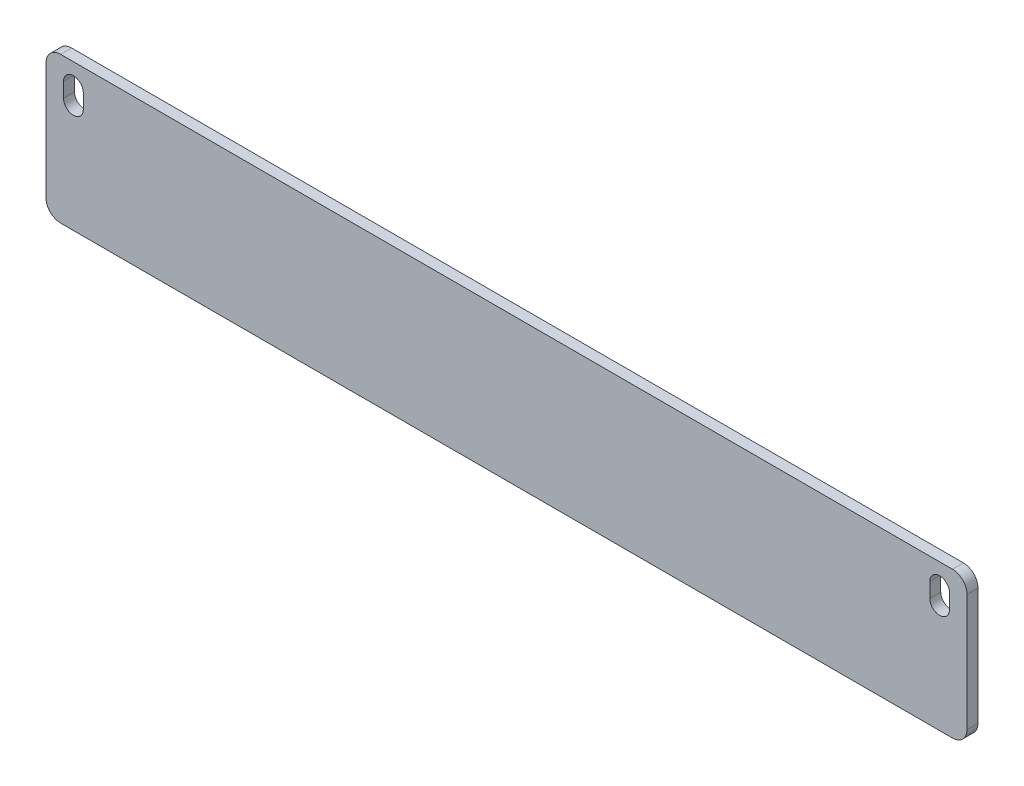
ISO-10303-21;
HEADER;
FILE_DESCRIPTION(('STEP AP214'),'2;1');
FILE_NAME('part.step','',(''),(''),'','','');
FILE_SCHEMA(('AUTOMOTIVE_DESIGN { 1 0 10303 214 1 1 1 1 }'));
ENDSEC;
DATA;
#1=APPLICATION_CONTEXT('core data for automotive mechanical design processes');
#2=APPLICATION_PROTOCOL_DEFINITION('international standard','automotive_design',2000,#1);
#3=PRODUCT_CONTEXT('',#1,'mechanical');
#4=PRODUCT('Part','Part','',(#3));
#5=PRODUCT_RELATED_PRODUCT_CATEGORY('part','',(#4));
#6=PRODUCT_DEFINITION_FORMATION('','',#4);
#7=PRODUCT_DEFINITION_CONTEXT('part definition',#1,'design');
#8=PRODUCT_DEFINITION('design','',#6,#7);
#9=PRODUCT_DEFINITION_SHAPE('','',#8);
#10=(LENGTH_UNIT() NAMED_UNIT(*) SI_UNIT(.MILLI.,.METRE.));
#11=(NAMED_UNIT(*) PLANE_ANGLE_UNIT() SI_UNIT($,.RADIAN.));
#12=(NAMED_UNIT(*) SI_UNIT($,.STERADIAN.) SOLID_ANGLE_UNIT());
#13=UNCERTAINTY_MEASURE_WITH_UNIT(LENGTH_MEASURE(1.E-05),#10,'distance_accuracy_value','');
#14=(GEOMETRIC_REPRESENTATION_CONTEXT(3) GLOBAL_UNCERTAINTY_ASSIGNED_CONTEXT((#13)) GLOBAL_UNIT_ASSIGNED_CONTEXT((#10,
#11,#12)) REPRESENTATION_CONTEXT('',''));
#15=CARTESIAN_POINT('',(0.,0.,0.));
#16=DIRECTION('',(0.,0.,1.));
#17=DIRECTION('',(1.,0.,0.));
#18=AXIS2_PLACEMENT_3D('',#15,#16,#17);
#19=CARTESIAN_POINT('',(0.,0.,3.));
#20=DIRECTION('',(0.,0.,-1.));
#21=DIRECTION('',(-1.,0.,0.));
#22=AXIS2_PLACEMENT_3D('',#19,#20,#21);
#23=PLANE('',#22);
#24=CARTESIAN_POINT('',(7.5,34.,3.));
#25=DIRECTION('',(0.,0.,1.));
#26=DIRECTION('',(1.,0.,0.));
#27=AXIS2_PLACEMENT_3D('',#24,#25,#26);
#28=CIRCLE('',#27,2.7);
#29=CARTESIAN_POINT('',(10.2,34.,3.));
#30=VERTEX_POINT('',#29);
#31=CARTESIAN_POINT('',(4.8,34.,3.));
#32=VERTEX_POINT('',#31);
#33=EDGE_CURVE('E195',#30,#32,#28,.T.);
#34=ORIENTED_EDGE('',*,*,#33,.F.);
#35=DIRECTION('',(0.,1.,0.));
#36=VECTOR('',#35,1.);
#37=CARTESIAN_POINT('',(10.2,34.,3.));
#38=LINE('',#37,#36);
#39=CARTESIAN_POINT('',(10.2,30.,3.));
#40=VERTEX_POINT('',#39);
#41=EDGE_CURVE('E203',#40,#30,#38,.T.);
#42=ORIENTED_EDGE('',*,*,#41,.F.);
#43=CARTESIAN_POINT('',(7.5,30.,3.));
#44=DIRECTION('',(0.,0.,1.));
#45=DIRECTION('',(1.,0.,0.));
#46=AXIS2_PLACEMENT_3D('',#43,#44,#45);
#47=CIRCLE('',#46,2.7);
#48=CARTESIAN_POINT('',(4.8,30.,3.));
#49=VERTEX_POINT('',#48);
#50=EDGE_CURVE('E200',#49,#40,#47,.T.);
#51=ORIENTED_EDGE('',*,*,#50,.F.);
#52=DIRECTION('',(0.,-1.,0.));
#53=VECTOR('',#52,1.);
#54=CARTESIAN_POINT('',(4.8,34.,3.));
#55=LINE('',#54,#53);
#56=EDGE_CURVE('E197',#32,#49,#55,.T.);
#57=ORIENTED_EDGE('',*,*,#56,.F.);
#58=EDGE_LOOP('',(#34,#42,#51,#57));
#59=FACE_BOUND('',#58,.T.);
#60=DIRECTION('',(1.,0.,0.));
#61=VECTOR('',#60,1.);
#62=CARTESIAN_POINT('',(0.,0.,3.));
#63=LINE('',#62,#61);
#64=CARTESIAN_POINT('',(4.,0.,3.));
#65=VERTEX_POINT('',#64);
#66=CARTESIAN_POINT('',(248.,0.,3.));
#67=VERTEX_POINT('',#66);
#68=EDGE_CURVE('E229',#65,#67,#63,.T.);
#69=ORIENTED_EDGE('',*,*,#68,.T.);
#70=CARTESIAN_POINT('',(248.,4.,3.));
#71=DIRECTION('',(0.,0.,-1.));
#72=DIRECTION('',(-1.,0.,0.));
#73=AXIS2_PLACEMENT_3D('',#70,#71,#72);
#74=CIRCLE('',#73,4.);
#75=CARTESIAN_POINT('',(252.,4.,3.));
#76=VERTEX_POINT('',#75);
#77=EDGE_CURVE('E269',#67,#76,#74,.F.);
#78=ORIENTED_EDGE('',*,*,#77,.T.);
#79=DIRECTION('',(0.,1.,0.));
#80=VECTOR('',#79,1.);
#81=CARTESIAN_POINT('',(252.,0.,3.));
#82=LINE('',#81,#80);
#83=CARTESIAN_POINT('',(252.,36.,3.));
#84=VERTEX_POINT('',#83);
#85=EDGE_CURVE('E233',#76,#84,#82,.T.);
#86=ORIENTED_EDGE('',*,*,#85,.T.);
#87=CARTESIAN_POINT('',(248.,36.,3.));
#88=DIRECTION('',(0.,0.,-1.));
#89=DIRECTION('',(-1.,0.,0.));
#90=AXIS2_PLACEMENT_3D('',#87,#88,#89);
#91=CIRCLE('',#90,4.);
#92=CARTESIAN_POINT('',(248.,40.,3.));
#93=VERTEX_POINT('',#92);
#94=EDGE_CURVE('E61',#84,#93,#91,.F.);
#95=ORIENTED_EDGE('',*,*,#94,.T.);
#96=DIRECTION('',(-1.,0.,0.));
#97=VECTOR('',#96,1.);
#98=CARTESIAN_POINT('',(0.,40.,3.));
#99=LINE('',#98,#97);
#100=CARTESIAN_POINT('',(4.,40.,3.));
#101=VERTEX_POINT('',#100);
#102=EDGE_CURVE('E235',#93,#101,#99,.T.);
#103=ORIENTED_EDGE('',*,*,#102,.T.);
#104=CARTESIAN_POINT('',(4.,36.,3.));
#105=DIRECTION('',(0.,0.,-1.));
#106=DIRECTION('',(-1.,0.,0.));
#107=AXIS2_PLACEMENT_3D('',#104,#105,#106);
#108=CIRCLE('',#107,4.);
#109=CARTESIAN_POINT('',(0.,36.,3.));
#110=VERTEX_POINT('',#109);
#111=EDGE_CURVE('E264',#101,#110,#108,.F.);
#112=ORIENTED_EDGE('',*,*,#111,.T.);
#113=DIRECTION('',(0.,-1.,0.));
#114=VECTOR('',#113,1.);
#115=CARTESIAN_POINT('',(0.,0.,3.));
#116=LINE('',#115,#114);
#117=CARTESIAN_POINT('',(0.,4.,3.));
#118=VERTEX_POINT('',#117);
#119=EDGE_CURVE('E226',#110,#118,#116,.T.);
#120=ORIENTED_EDGE('',*,*,#119,.T.);
#121=CARTESIAN_POINT('',(4.,4.,3.));
#122=DIRECTION('',(0.,0.,-1.));
#123=DIRECTION('',(-1.,0.,0.));
#124=AXIS2_PLACEMENT_3D('',#121,#122,#123);
#125=CIRCLE('',#124,4.);
#126=EDGE_CURVE('E266',#118,#65,#125,.F.);
#127=ORIENTED_EDGE('',*,*,#126,.T.);
#128=EDGE_LOOP('',(#69,#78,#86,#95,#103,#112,#120,#127));
#129=FACE_BOUND('',#128,.T.);
#130=CARTESIAN_POINT('',(244.5,34.,3.));
#131=DIRECTION('',(0.,0.,1.));
#132=DIRECTION('',(1.,0.,0.));
#133=AXIS2_PLACEMENT_3D('',#130,#131,#132);
#134=CIRCLE('',#133,2.70000000000001);
#135=CARTESIAN_POINT('',(247.2,34.,3.));
#136=VERTEX_POINT('',#135);
#137=CARTESIAN_POINT('',(241.8,34.,3.));
#138=VERTEX_POINT('',#137);
#139=EDGE_CURVE('E154',#136,#138,#134,.T.);
#140=ORIENTED_EDGE('',*,*,#139,.F.);
#141=DIRECTION('',(0.,1.,0.));
#142=VECTOR('',#141,1.);
#143=CARTESIAN_POINT('',(247.2,34.,3.));
#144=LINE('',#143,#142);
#145=CARTESIAN_POINT('',(247.2,30.,3.));
#146=VERTEX_POINT('',#145);
#147=EDGE_CURVE('E179',#146,#136,#144,.T.);
#148=ORIENTED_EDGE('',*,*,#147,.F.);
#149=CARTESIAN_POINT('',(244.5,30.,3.));
#150=DIRECTION('',(0.,0.,1.));
#151=DIRECTION('',(1.,0.,0.));
#152=AXIS2_PLACEMENT_3D('',#149,#150,#151);
#153=CIRCLE('',#152,2.70000000000001);
#154=CARTESIAN_POINT('',(241.8,30.,3.));
#155=VERTEX_POINT('',#154);
#156=EDGE_CURVE('E177',#155,#146,#153,.T.);
#157=ORIENTED_EDGE('',*,*,#156,.F.);
#158=DIRECTION('',(0.,-1.,0.));
#159=VECTOR('',#158,1.);
#160=CARTESIAN_POINT('',(241.8,34.,3.));
#161=LINE('',#160,#159);
#162=EDGE_CURVE('E164',#138,#155,#161,.T.);
#163=ORIENTED_EDGE('',*,*,#162,.F.);
#164=EDGE_LOOP('',(#140,#148,#157,#163));
#165=FACE_BOUND('',#164,.T.);
#166=ADVANCED_FACE('F39',(#59,#129,#165),#23,.F.);
#167=CARTESIAN_POINT('',(0.,0.,0.));
#168=DIRECTION('',(0.,0.,-1.));
#169=DIRECTION('',(-1.,0.,0.));
#170=AXIS2_PLACEMENT_3D('',#167,#168,#169);
#171=PLANE('',#170);
#172=DIRECTION('',(0.,1.,0.));
#173=VECTOR('',#172,1.);
#174=CARTESIAN_POINT('',(252.,0.,0.));
#175=LINE('',#174,#173);
#176=CARTESIAN_POINT('',(252.,4.,0.));
#177=VERTEX_POINT('',#176);
#178=CARTESIAN_POINT('',(252.,36.,0.));
#179=VERTEX_POINT('',#178);
#180=EDGE_CURVE('E243',#177,#179,#175,.T.);
#181=ORIENTED_EDGE('',*,*,#180,.F.);
#182=CARTESIAN_POINT('',(248.,4.,0.));
#183=DIRECTION('',(0.,0.,-1.));
#184=DIRECTION('',(-1.,0.,0.));
#185=AXIS2_PLACEMENT_3D('',#182,#183,#184);
#186=CIRCLE('',#185,4.);
#187=CARTESIAN_POINT('',(248.,0.,0.));
#188=VERTEX_POINT('',#187);
#189=EDGE_CURVE('E257',#177,#188,#186,.T.);
#190=ORIENTED_EDGE('',*,*,#189,.T.);
#191=DIRECTION('',(1.,0.,0.));
#192=VECTOR('',#191,1.);
#193=CARTESIAN_POINT('',(0.,0.,0.));
#194=LINE('',#193,#192);
#195=CARTESIAN_POINT('',(4.,0.,0.));
#196=VERTEX_POINT('',#195);
#197=EDGE_CURVE('E240',#196,#188,#194,.T.);
#198=ORIENTED_EDGE('',*,*,#197,.F.);
#199=CARTESIAN_POINT('',(4.,4.,0.));
#200=DIRECTION('',(0.,0.,-1.));
#201=DIRECTION('',(-1.,0.,0.));
#202=AXIS2_PLACEMENT_3D('',#199,#200,#201);
#203=CIRCLE('',#202,4.);
#204=CARTESIAN_POINT('',(0.,4.,0.));
#205=VERTEX_POINT('',#204);
#206=EDGE_CURVE('E253',#196,#205,#203,.T.);
#207=ORIENTED_EDGE('',*,*,#206,.T.);
#208=DIRECTION('',(0.,-1.,0.));
#209=VECTOR('',#208,1.);
#210=CARTESIAN_POINT('',(0.,0.,0.));
#211=LINE('',#210,#209);
#212=CARTESIAN_POINT('',(0.,36.,0.));
#213=VERTEX_POINT('',#212);
#214=EDGE_CURVE('E225',#213,#205,#211,.T.);
#215=ORIENTED_EDGE('',*,*,#214,.F.);
#216=CARTESIAN_POINT('',(4.,36.,0.));
#217=DIRECTION('',(0.,0.,-1.));
#218=DIRECTION('',(-1.,0.,0.));
#219=AXIS2_PLACEMENT_3D('',#216,#217,#218);
#220=CIRCLE('',#219,4.);
#221=CARTESIAN_POINT('',(4.,40.,0.));
#222=VERTEX_POINT('',#221);
#223=EDGE_CURVE('E251',#213,#222,#220,.T.);
#224=ORIENTED_EDGE('',*,*,#223,.T.);
#225=DIRECTION('',(-1.,0.,0.));
#226=VECTOR('',#225,1.);
#227=CARTESIAN_POINT('',(0.,40.,0.));
#228=LINE('',#227,#226);
#229=CARTESIAN_POINT('',(248.,40.,0.));
#230=VERTEX_POINT('',#229);
#231=EDGE_CURVE('E230',#230,#222,#228,.T.);
#232=ORIENTED_EDGE('',*,*,#231,.F.);
#233=CARTESIAN_POINT('',(248.,36.,0.));
#234=DIRECTION('',(0.,0.,-1.));
#235=DIRECTION('',(-1.,0.,0.));
#236=AXIS2_PLACEMENT_3D('',#233,#234,#235);
#237=CIRCLE('',#236,4.);
#238=EDGE_CURVE('E255',#230,#179,#237,.T.);
#239=ORIENTED_EDGE('',*,*,#238,.T.);
#240=EDGE_LOOP('',(#181,#190,#198,#207,#215,#224,#232,#239));
#241=FACE_BOUND('',#240,.T.);
#242=DIRECTION('',(0.,1.,0.));
#243=VECTOR('',#242,1.);
#244=CARTESIAN_POINT('',(10.2,34.,0.));
#245=LINE('',#244,#243);
#246=CARTESIAN_POINT('',(10.2,30.,0.));
#247=VERTEX_POINT('',#246);
#248=CARTESIAN_POINT('',(10.2,34.,0.));
#249=VERTEX_POINT('',#248);
#250=EDGE_CURVE('E198',#247,#249,#245,.T.);
#251=ORIENTED_EDGE('',*,*,#250,.T.);
#252=CARTESIAN_POINT('',(7.5,34.,0.));
#253=DIRECTION('',(0.,0.,1.));
#254=DIRECTION('',(1.,0.,0.));
#255=AXIS2_PLACEMENT_3D('',#252,#253,#254);
#256=CIRCLE('',#255,2.7);
#257=CARTESIAN_POINT('',(4.8,34.,0.));
#258=VERTEX_POINT('',#257);
#259=EDGE_CURVE('E172',#249,#258,#256,.T.);
#260=ORIENTED_EDGE('',*,*,#259,.T.);
#261=DIRECTION('',(0.,-1.,0.));
#262=VECTOR('',#261,1.);
#263=CARTESIAN_POINT('',(4.8,34.,0.));
#264=LINE('',#263,#262);
#265=CARTESIAN_POINT('',(4.8,30.,0.));
#266=VERTEX_POINT('',#265);
#267=EDGE_CURVE('E208',#258,#266,#264,.T.);
#268=ORIENTED_EDGE('',*,*,#267,.T.);
#269=CARTESIAN_POINT('',(7.5,30.,0.));
#270=DIRECTION('',(0.,0.,1.));
#271=DIRECTION('',(1.,0.,0.));
#272=AXIS2_PLACEMENT_3D('',#269,#270,#271);
#273=CIRCLE('',#272,2.7);
#274=EDGE_CURVE('E211',#266,#247,#273,.T.);
#275=ORIENTED_EDGE('',*,*,#274,.T.);
#276=EDGE_LOOP('',(#251,#260,#268,#275));
#277=FACE_BOUND('',#276,.T.);
#278=DIRECTION('',(0.,1.,0.));
#279=VECTOR('',#278,1.);
#280=CARTESIAN_POINT('',(247.2,34.,0.));
#281=LINE('',#280,#279);
#282=CARTESIAN_POINT('',(247.2,30.,0.));
#283=VERTEX_POINT('',#282);
#284=CARTESIAN_POINT('',(247.2,34.,0.));
#285=VERTEX_POINT('',#284);
#286=EDGE_CURVE('E165',#283,#285,#281,.T.);
#287=ORIENTED_EDGE('',*,*,#286,.T.);
#288=CARTESIAN_POINT('',(244.5,34.,0.));
#289=DIRECTION('',(0.,0.,1.));
#290=DIRECTION('',(1.,0.,0.));
#291=AXIS2_PLACEMENT_3D('',#288,#289,#290);
#292=CIRCLE('',#291,2.70000000000001);
#293=CARTESIAN_POINT('',(241.8,34.,0.));
#294=VERTEX_POINT('',#293);
#295=EDGE_CURVE('E183',#285,#294,#292,.T.);
#296=ORIENTED_EDGE('',*,*,#295,.T.);
#297=DIRECTION('',(0.,-1.,0.));
#298=VECTOR('',#297,1.);
#299=CARTESIAN_POINT('',(241.8,34.,0.));
#300=LINE('',#299,#298);
#301=CARTESIAN_POINT('',(241.8,30.,0.));
#302=VERTEX_POINT('',#301);
#303=EDGE_CURVE('E171',#294,#302,#300,.T.);
#304=ORIENTED_EDGE('',*,*,#303,.T.);
#305=CARTESIAN_POINT('',(244.5,30.,0.));
#306=DIRECTION('',(0.,0.,1.));
#307=DIRECTION('',(1.,0.,0.));
#308=AXIS2_PLACEMENT_3D('',#305,#306,#307);
#309=CIRCLE('',#308,2.70000000000001);
#310=EDGE_CURVE('E186',#302,#283,#309,.T.);
#311=ORIENTED_EDGE('',*,*,#310,.T.);
#312=EDGE_LOOP('',(#287,#296,#304,#311));
#313=FACE_BOUND('',#312,.T.);
#314=ADVANCED_FACE('F285',(#241,#277,#313),#171,.T.);
#315=CARTESIAN_POINT('',(0.,0.,3.));
#316=DIRECTION('',(1.,0.,0.));
#317=DIRECTION('',(0.,0.,-1.));
#318=AXIS2_PLACEMENT_3D('',#315,#316,#317);
#319=PLANE('',#318);
#320=ORIENTED_EDGE('',*,*,#214,.T.);
#321=DIRECTION('',(0.,0.,-1.));
#322=VECTOR('',#321,1.);
#323=CARTESIAN_POINT('',(0.,4.,3.));
#324=LINE('',#323,#322);
#325=EDGE_CURVE('E11',#205,#118,#324,.F.);
#326=ORIENTED_EDGE('',*,*,#325,.T.);
#327=ORIENTED_EDGE('',*,*,#119,.F.);
#328=DIRECTION('',(0.,0.,-1.));
#329=VECTOR('',#328,1.);
#330=CARTESIAN_POINT('',(0.,36.,3.));
#331=LINE('',#330,#329);
#332=EDGE_CURVE('E47',#110,#213,#331,.T.);
#333=ORIENTED_EDGE('',*,*,#332,.T.);
#334=EDGE_LOOP('',(#320,#326,#327,#333));
#335=FACE_BOUND('',#334,.T.);
#336=ADVANCED_FACE('F279',(#335),#319,.F.);
#337=CARTESIAN_POINT('',(0.,0.,3.));
#338=DIRECTION('',(0.,1.,0.));
#339=DIRECTION('',(0.,0.,1.));
#340=AXIS2_PLACEMENT_3D('',#337,#338,#339);
#341=PLANE('',#340);
#342=ORIENTED_EDGE('',*,*,#197,.T.);
#343=DIRECTION('',(0.,0.,-1.));
#344=VECTOR('',#343,1.);
#345=CARTESIAN_POINT('',(248.,0.,3.));
#346=LINE('',#345,#344);
#347=EDGE_CURVE('E262',#188,#67,#346,.F.);
#348=ORIENTED_EDGE('',*,*,#347,.T.);
#349=ORIENTED_EDGE('',*,*,#68,.F.);
#350=DIRECTION('',(0.,0.,-1.));
#351=VECTOR('',#350,1.);
#352=CARTESIAN_POINT('',(4.,0.,3.));
#353=LINE('',#352,#351);
#354=EDGE_CURVE('E259',#65,#196,#353,.T.);
#355=ORIENTED_EDGE('',*,*,#354,.T.);
#356=EDGE_LOOP('',(#342,#348,#349,#355));
#357=FACE_BOUND('',#356,.T.);
#358=ADVANCED_FACE('F295',(#357),#341,.F.);
#359=CARTESIAN_POINT('',(252.,0.,3.));
#360=DIRECTION('',(-1.,0.,0.));
#361=DIRECTION('',(0.,0.,1.));
#362=AXIS2_PLACEMENT_3D('',#359,#360,#361);
#363=PLANE('',#362);
#364=ORIENTED_EDGE('',*,*,#85,.F.);
#365=DIRECTION('',(0.,0.,-1.));
#366=VECTOR('',#365,1.);
#367=CARTESIAN_POINT('',(252.,4.,3.));
#368=LINE('',#367,#366);
#369=EDGE_CURVE('E248',#76,#177,#368,.T.);
#370=ORIENTED_EDGE('',*,*,#369,.T.);
#371=ORIENTED_EDGE('',*,*,#180,.T.);
#372=DIRECTION('',(0.,0.,-1.));
#373=VECTOR('',#372,1.);
#374=CARTESIAN_POINT('',(252.,36.,3.));
#375=LINE('',#374,#373);
#376=EDGE_CURVE('E237',#179,#84,#375,.F.);
#377=ORIENTED_EDGE('',*,*,#376,.T.);
#378=EDGE_LOOP('',(#364,#370,#371,#377));
#379=FACE_BOUND('',#378,.T.);
#380=ADVANCED_FACE('F303',(#379),#363,.F.);
#381=CARTESIAN_POINT('',(0.,40.,3.));
#382=DIRECTION('',(0.,-1.,0.));
#383=DIRECTION('',(0.,0.,-1.));
#384=AXIS2_PLACEMENT_3D('',#381,#382,#383);
#385=PLANE('',#384);
#386=ORIENTED_EDGE('',*,*,#102,.F.);
#387=DIRECTION('',(0.,0.,-1.));
#388=VECTOR('',#387,1.);
#389=CARTESIAN_POINT('',(248.,40.,3.));
#390=LINE('',#389,#388);
#391=EDGE_CURVE('E272',#93,#230,#390,.T.);
#392=ORIENTED_EDGE('',*,*,#391,.T.);
#393=ORIENTED_EDGE('',*,*,#231,.T.);
#394=DIRECTION('',(0.,0.,-1.));
#395=VECTOR('',#394,1.);
#396=CARTESIAN_POINT('',(4.,40.,3.));
#397=LINE('',#396,#395);
#398=EDGE_CURVE('E54',#222,#101,#397,.F.);
#399=ORIENTED_EDGE('',*,*,#398,.T.);
#400=EDGE_LOOP('',(#386,#392,#393,#399));
#401=FACE_BOUND('',#400,.T.);
#402=ADVANCED_FACE('F308',(#401),#385,.F.);
#403=CARTESIAN_POINT('',(7.5,34.,3.));
#404=DIRECTION('',(0.,0.,-1.));
#405=DIRECTION('',(-1.,0.,0.));
#406=AXIS2_PLACEMENT_3D('',#403,#404,#405);
#407=CYLINDRICAL_SURFACE('',#406,2.7);
#408=ORIENTED_EDGE('',*,*,#259,.F.);
#409=DIRECTION('',(0.,0.,-1.));
#410=VECTOR('',#409,1.);
#411=CARTESIAN_POINT('',(10.2,34.,3.));
#412=LINE('',#411,#410);
#413=EDGE_CURVE('E205',#30,#249,#412,.T.);
#414=ORIENTED_EDGE('',*,*,#413,.F.);
#415=ORIENTED_EDGE('',*,*,#33,.T.);
#416=DIRECTION('',(0.,0.,-1.));
#417=VECTOR('',#416,1.);
#418=CARTESIAN_POINT('',(4.8,34.,3.));
#419=LINE('',#418,#417);
#420=EDGE_CURVE('E222',#32,#258,#419,.T.);
#421=ORIENTED_EDGE('',*,*,#420,.T.);
#422=EDGE_LOOP('',(#408,#414,#415,#421));
#423=FACE_BOUND('',#422,.T.);
#424=ADVANCED_FACE('F323',(#423),#407,.F.);
#425=CARTESIAN_POINT('',(4.8,34.,3.));
#426=DIRECTION('',(1.,0.,0.));
#427=DIRECTION('',(0.,1.,0.));
#428=AXIS2_PLACEMENT_3D('',#425,#426,#427);
#429=PLANE('',#428);
#430=ORIENTED_EDGE('',*,*,#267,.F.);
#431=ORIENTED_EDGE('',*,*,#420,.F.);
#432=ORIENTED_EDGE('',*,*,#56,.T.);
#433=DIRECTION('',(0.,0.,-1.));
#434=VECTOR('',#433,1.);
#435=CARTESIAN_POINT('',(4.8,30.,3.));
#436=LINE('',#435,#434);
#437=EDGE_CURVE('E220',#49,#266,#436,.T.);
#438=ORIENTED_EDGE('',*,*,#437,.T.);
#439=EDGE_LOOP('',(#430,#431,#432,#438));
#440=FACE_BOUND('',#439,.T.);
#441=ADVANCED_FACE('F405',(#440),#429,.T.);
#442=CARTESIAN_POINT('',(7.5,30.,3.));
#443=DIRECTION('',(0.,0.,-1.));
#444=DIRECTION('',(-1.,0.,0.));
#445=AXIS2_PLACEMENT_3D('',#442,#443,#444);
#446=CYLINDRICAL_SURFACE('',#445,2.7);
#447=ORIENTED_EDGE('',*,*,#274,.F.);
#448=ORIENTED_EDGE('',*,*,#437,.F.);
#449=ORIENTED_EDGE('',*,*,#50,.T.);
#450=DIRECTION('',(0.,0.,-1.));
#451=VECTOR('',#450,1.);
#452=CARTESIAN_POINT('',(10.2,30.,3.));
#453=LINE('',#452,#451);
#454=EDGE_CURVE('E218',#40,#247,#453,.T.);
#455=ORIENTED_EDGE('',*,*,#454,.T.);
#456=EDGE_LOOP('',(#447,#448,#449,#455));
#457=FACE_BOUND('',#456,.T.);
#458=ADVANCED_FACE('F396',(#457),#446,.F.);
#459=CARTESIAN_POINT('',(10.2,34.,3.));
#460=DIRECTION('',(-1.,0.,0.));
#461=DIRECTION('',(0.,-1.,0.));
#462=AXIS2_PLACEMENT_3D('',#459,#460,#461);
#463=PLANE('',#462);
#464=ORIENTED_EDGE('',*,*,#250,.F.);
#465=ORIENTED_EDGE('',*,*,#454,.F.);
#466=ORIENTED_EDGE('',*,*,#41,.T.);
#467=ORIENTED_EDGE('',*,*,#413,.T.);
#468=EDGE_LOOP('',(#464,#465,#466,#467));
#469=FACE_BOUND('',#468,.T.);
#470=ADVANCED_FACE('F388',(#469),#463,.T.);
#471=CARTESIAN_POINT('',(244.5,34.,3.));
#472=DIRECTION('',(0.,0.,-1.));
#473=DIRECTION('',(-1.,0.,0.));
#474=AXIS2_PLACEMENT_3D('',#471,#472,#473);
#475=CYLINDRICAL_SURFACE('',#474,2.70000000000001);
#476=ORIENTED_EDGE('',*,*,#295,.F.);
#477=DIRECTION('',(0.,0.,-1.));
#478=VECTOR('',#477,1.);
#479=CARTESIAN_POINT('',(247.2,34.,3.));
#480=LINE('',#479,#478);
#481=EDGE_CURVE('E160',#136,#285,#480,.T.);
#482=ORIENTED_EDGE('',*,*,#481,.F.);
#483=ORIENTED_EDGE('',*,*,#139,.T.);
#484=DIRECTION('',(0.,0.,-1.));
#485=VECTOR('',#484,1.);
#486=CARTESIAN_POINT('',(241.8,34.,3.));
#487=LINE('',#486,#485);
#488=EDGE_CURVE('E157',#138,#294,#487,.T.);
#489=ORIENTED_EDGE('',*,*,#488,.T.);
#490=EDGE_LOOP('',(#476,#482,#483,#489));
#491=FACE_BOUND('',#490,.T.);
#492=ADVANCED_FACE('F156',(#491),#475,.F.);
#493=CARTESIAN_POINT('',(241.8,34.,3.));
#494=DIRECTION('',(1.,0.,0.));
#495=DIRECTION('',(0.,0.,-1.));
#496=AXIS2_PLACEMENT_3D('',#493,#494,#495);
#497=PLANE('',#496);
#498=ORIENTED_EDGE('',*,*,#303,.F.);
#499=ORIENTED_EDGE('',*,*,#488,.F.);
#500=ORIENTED_EDGE('',*,*,#162,.T.);
#501=DIRECTION('',(0.,0.,-1.));
#502=VECTOR('',#501,1.);
#503=CARTESIAN_POINT('',(241.8,30.,3.));
#504=LINE('',#503,#502);
#505=EDGE_CURVE('E173',#155,#302,#504,.T.);
#506=ORIENTED_EDGE('',*,*,#505,.T.);
#507=EDGE_LOOP('',(#498,#499,#500,#506));
#508=FACE_BOUND('',#507,.T.);
#509=ADVANCED_FACE('F168',(#508),#497,.T.);
#510=CARTESIAN_POINT('',(244.5,30.,3.));
#511=DIRECTION('',(0.,0.,-1.));
#512=DIRECTION('',(-1.,0.,0.));
#513=AXIS2_PLACEMENT_3D('',#510,#511,#512);
#514=CYLINDRICAL_SURFACE('',#513,2.70000000000001);
#515=ORIENTED_EDGE('',*,*,#310,.F.);
#516=ORIENTED_EDGE('',*,*,#505,.F.);
#517=ORIENTED_EDGE('',*,*,#156,.T.);
#518=DIRECTION('',(0.,0.,-1.));
#519=VECTOR('',#518,1.);
#520=CARTESIAN_POINT('',(247.2,30.,3.));
#521=LINE('',#520,#519);
#522=EDGE_CURVE('E192',#146,#283,#521,.T.);
#523=ORIENTED_EDGE('',*,*,#522,.T.);
#524=EDGE_LOOP('',(#515,#516,#517,#523));
#525=FACE_BOUND('',#524,.T.);
#526=ADVANCED_FACE('F364',(#525),#514,.F.);
#527=CARTESIAN_POINT('',(247.2,34.,3.));
#528=DIRECTION('',(-1.,0.,0.));
#529=DIRECTION('',(0.,0.,1.));
#530=AXIS2_PLACEMENT_3D('',#527,#528,#529);
#531=PLANE('',#530);
#532=ORIENTED_EDGE('',*,*,#286,.F.);
#533=ORIENTED_EDGE('',*,*,#522,.F.);
#534=ORIENTED_EDGE('',*,*,#147,.T.);
#535=ORIENTED_EDGE('',*,*,#481,.T.);
#536=EDGE_LOOP('',(#532,#533,#534,#535));
#537=FACE_BOUND('',#536,.T.);
#538=ADVANCED_FACE('F336',(#537),#531,.T.);
#539=CARTESIAN_POINT('',(248.,4.,3.));
#540=DIRECTION('',(0.,0.,-1.));
#541=DIRECTION('',(-1.,0.,0.));
#542=AXIS2_PLACEMENT_3D('',#539,#540,#541);
#543=CYLINDRICAL_SURFACE('',#542,4.);
#544=ORIENTED_EDGE('',*,*,#77,.F.);
#545=ORIENTED_EDGE('',*,*,#347,.F.);
#546=ORIENTED_EDGE('',*,*,#189,.F.);
#547=ORIENTED_EDGE('',*,*,#369,.F.);
#548=EDGE_LOOP('',(#544,#545,#546,#547));
#549=FACE_BOUND('',#548,.T.);
#550=ADVANCED_FACE('F301',(#549),#543,.T.);
#551=CARTESIAN_POINT('',(248.,36.,3.));
#552=DIRECTION('',(0.,0.,-1.));
#553=DIRECTION('',(-1.,0.,0.));
#554=AXIS2_PLACEMENT_3D('',#551,#552,#553);
#555=CYLINDRICAL_SURFACE('',#554,4.);
#556=ORIENTED_EDGE('',*,*,#94,.F.);
#557=ORIENTED_EDGE('',*,*,#376,.F.);
#558=ORIENTED_EDGE('',*,*,#238,.F.);
#559=ORIENTED_EDGE('',*,*,#391,.F.);
#560=EDGE_LOOP('',(#556,#557,#558,#559));
#561=FACE_BOUND('',#560,.T.);
#562=ADVANCED_FACE('F307',(#561),#555,.T.);
#563=CARTESIAN_POINT('',(4.,4.,3.));
#564=DIRECTION('',(0.,0.,-1.));
#565=DIRECTION('',(-1.,0.,0.));
#566=AXIS2_PLACEMENT_3D('',#563,#564,#565);
#567=CYLINDRICAL_SURFACE('',#566,4.);
#568=ORIENTED_EDGE('',*,*,#126,.F.);
#569=ORIENTED_EDGE('',*,*,#325,.F.);
#570=ORIENTED_EDGE('',*,*,#206,.F.);
#571=ORIENTED_EDGE('',*,*,#354,.F.);
#572=EDGE_LOOP('',(#568,#569,#570,#571));
#573=FACE_BOUND('',#572,.T.);
#574=ADVANCED_FACE('F292',(#573),#567,.T.);
#575=CARTESIAN_POINT('',(4.,36.,3.));
#576=DIRECTION('',(0.,0.,-1.));
#577=DIRECTION('',(-1.,0.,0.));
#578=AXIS2_PLACEMENT_3D('',#575,#576,#577);
#579=CYLINDRICAL_SURFACE('',#578,4.);
#580=ORIENTED_EDGE('',*,*,#111,.F.);
#581=ORIENTED_EDGE('',*,*,#398,.F.);
#582=ORIENTED_EDGE('',*,*,#223,.F.);
#583=ORIENTED_EDGE('',*,*,#332,.F.);
#584=EDGE_LOOP('',(#580,#581,#582,#583));
#585=FACE_BOUND('',#584,.T.);
#586=ADVANCED_FACE('F41',(#585),#579,.T.);
#587=CLOSED_SHELL('',(#166,#314,#336,#358,#380,#402,#424,#441,#458,#470,#492,#509,#526,#538,
#550,#562,#574,#586));
#588=MANIFOLD_SOLID_BREP('B2',#587);
#589=ADVANCED_BREP_SHAPE_REPRESENTATION('',(#18,#588),#14);
#590=SHAPE_DEFINITION_REPRESENTATION(#9,#589);
ENDSEC;
END-ISO-10303-21;
